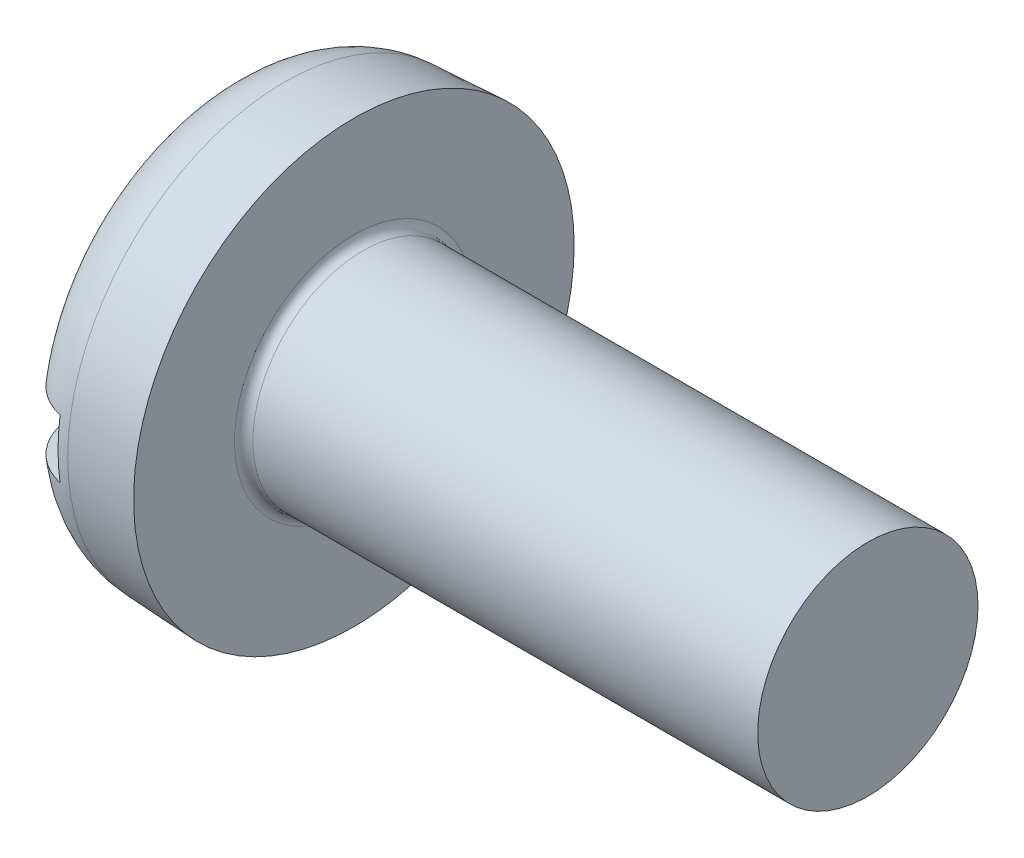
ISO-10303-21;
HEADER;
FILE_DESCRIPTION(('STEP AP214'),'2;1');
FILE_NAME('part.step','',(''),(''),'','','');
FILE_SCHEMA(('AUTOMOTIVE_DESIGN { 1 0 10303 214 1 1 1 1 }'));
ENDSEC;
DATA;
#1=APPLICATION_CONTEXT('core data for automotive mechanical design processes');
#2=APPLICATION_PROTOCOL_DEFINITION('international standard','automotive_design',2000,#1);
#3=PRODUCT_CONTEXT('',#1,'mechanical');
#4=PRODUCT('Part','Part','',(#3));
#5=PRODUCT_RELATED_PRODUCT_CATEGORY('part','',(#4));
#6=PRODUCT_DEFINITION_FORMATION('','',#4);
#7=PRODUCT_DEFINITION_CONTEXT('part definition',#1,'design');
#8=PRODUCT_DEFINITION('design','',#6,#7);
#9=PRODUCT_DEFINITION_SHAPE('','',#8);
#10=(LENGTH_UNIT() NAMED_UNIT(*) SI_UNIT(.MILLI.,.METRE.));
#11=(NAMED_UNIT(*) PLANE_ANGLE_UNIT() SI_UNIT($,.RADIAN.));
#12=(NAMED_UNIT(*) SI_UNIT($,.STERADIAN.) SOLID_ANGLE_UNIT());
#13=UNCERTAINTY_MEASURE_WITH_UNIT(LENGTH_MEASURE(1.E-05),#10,'distance_accuracy_value','');
#14=(GEOMETRIC_REPRESENTATION_CONTEXT(3) GLOBAL_UNCERTAINTY_ASSIGNED_CONTEXT((#13)) GLOBAL_UNIT_ASSIGNED_CONTEXT((#10,
#11,#12)) REPRESENTATION_CONTEXT('',''));
#15=CARTESIAN_POINT('',(0.,0.,0.));
#16=DIRECTION('',(0.,0.,1.));
#17=DIRECTION('',(1.,0.,0.));
#18=AXIS2_PLACEMENT_3D('',#15,#16,#17);
#19=CARTESIAN_POINT('',(0.,0.,0.));
#20=DIRECTION('',(1.,0.,0.));
#21=DIRECTION('',(0.,0.,-1.));
#22=AXIS2_PLACEMENT_3D('',#19,#20,#21);
#23=PLANE('',#22);
#24=CARTESIAN_POINT('',(0.,0.,0.));
#25=DIRECTION('',(1.,0.,0.));
#26=DIRECTION('',(0.,0.,-1.));
#27=AXIS2_PLACEMENT_3D('',#24,#25,#26);
#28=CIRCLE('',#27,4.10319577449427);
#29=CARTESIAN_POINT('',(0.,0.8,4.02445220667703));
#30=VERTEX_POINT('',#29);
#31=CARTESIAN_POINT('',(0.,0.8,-4.02445220667703));
#32=VERTEX_POINT('',#31);
#33=EDGE_CURVE('E98',#30,#32,#28,.F.);
#34=ORIENTED_EDGE('',*,*,#33,.T.);
#35=DIRECTION('',(0.,0.,1.));
#36=VECTOR('',#35,1.);
#37=CARTESIAN_POINT('',(0.,0.8,-6.));
#38=LINE('',#37,#36);
#39=EDGE_CURVE('E92',#32,#30,#38,.T.);
#40=ORIENTED_EDGE('',*,*,#39,.T.);
#41=EDGE_LOOP('',(#34,#40));
#42=FACE_BOUND('',#41,.T.);
#43=ADVANCED_FACE('F37',(#42),#23,.F.);
#44=CARTESIAN_POINT('',(3.6,0.,0.));
#45=DIRECTION('',(1.,0.,0.));
#46=DIRECTION('',(0.,0.,-1.));
#47=AXIS2_PLACEMENT_3D('',#44,#45,#46);
#48=PLANE('',#47);
#49=CARTESIAN_POINT('',(3.6,0.,0.));
#50=DIRECTION('',(1.,0.,0.));
#51=DIRECTION('',(0.,0.,-1.));
#52=AXIS2_PLACEMENT_3D('',#49,#50,#51);
#53=CIRCLE('',#52,3.25);
#54=CARTESIAN_POINT('',(3.6,0.,-3.25));
#55=VERTEX_POINT('',#54);
#56=EDGE_CURVE('E11',#55,#55,#53,.F.);
#57=ORIENTED_EDGE('',*,*,#56,.T.);
#58=EDGE_LOOP('',(#57));
#59=FACE_BOUND('',#58,.T.);
#60=CARTESIAN_POINT('',(3.6,0.,0.));
#61=DIRECTION('',(1.,0.,0.));
#62=DIRECTION('',(0.,0.,-1.));
#63=AXIS2_PLACEMENT_3D('',#60,#61,#62);
#64=CIRCLE('',#63,6.);
#65=CARTESIAN_POINT('',(3.6,0.,-6.));
#66=VERTEX_POINT('',#65);
#67=EDGE_CURVE('E169',#66,#66,#64,.T.);
#68=ORIENTED_EDGE('',*,*,#67,.T.);
#69=EDGE_LOOP('',(#68));
#70=FACE_BOUND('',#69,.T.);
#71=ADVANCED_FACE('F145',(#59,#70),#48,.T.);
#72=CARTESIAN_POINT('',(3.6,0.,0.));
#73=DIRECTION('',(1.,0.,0.));
#74=DIRECTION('',(0.,0.,-1.));
#75=AXIS2_PLACEMENT_3D('',#72,#73,#74);
#76=CONICAL_SURFACE('',#75,6.,0.05235987755983);
#77=CARTESIAN_POINT('',(1.7057952787627,0.,0.));
#78=DIRECTION('',(1.,0.,0.));
#79=DIRECTION('',(0.,0.,-1.));
#80=AXIS2_PLACEMENT_3D('',#77,#78,#79);
#81=CIRCLE('',#80,5.9007289370525);
#82=CARTESIAN_POINT('',(1.7057952787627,0.,-5.9007289370525));
#83=VERTEX_POINT('',#82);
#84=EDGE_CURVE('E102',#83,#83,#81,.T.);
#85=ORIENTED_EDGE('',*,*,#84,.T.);
#86=EDGE_LOOP('',(#85));
#87=FACE_BOUND('',#86,.T.);
#88=ORIENTED_EDGE('',*,*,#67,.F.);
#89=EDGE_LOOP('',(#88));
#90=FACE_BOUND('',#89,.T.);
#91=ADVANCED_FACE('F151',(#87,#90),#76,.T.);
#92=CARTESIAN_POINT('',(0.,-0.8,-4.02445220667703));
#93=VERTEX_POINT('',#92);
#94=CARTESIAN_POINT('',(0.,-0.8,4.02445220667703));
#95=VERTEX_POINT('',#94);
#96=EDGE_CURVE('E91',#93,#95,#28,.F.);
#97=ORIENTED_EDGE('',*,*,#96,.T.);
#98=DIRECTION('',(0.,0.,1.));
#99=VECTOR('',#98,1.);
#100=CARTESIAN_POINT('',(0.,-0.8,-6.));
#101=LINE('',#100,#99);
#102=EDGE_CURVE('E52',#93,#95,#101,.T.);
#103=ORIENTED_EDGE('',*,*,#102,.F.);
#104=EDGE_LOOP('',(#97,#103));
#105=FACE_BOUND('',#104,.T.);
#106=ADVANCED_FACE('F90',(#105),#23,.F.);
#107=CARTESIAN_POINT('',(17.6,0.,0.));
#108=DIRECTION('',(-1.,0.,0.));
#109=DIRECTION('',(0.,0.,1.));
#110=AXIS2_PLACEMENT_3D('',#107,#108,#109);
#111=CYLINDRICAL_SURFACE('',#110,3.);
#112=CARTESIAN_POINT('',(3.85,0.,0.));
#113=DIRECTION('',(1.,0.,0.));
#114=DIRECTION('',(0.,0.,-1.));
#115=AXIS2_PLACEMENT_3D('',#112,#113,#114);
#116=CIRCLE('',#115,3.);
#117=CARTESIAN_POINT('',(3.85,0.,-3.));
#118=VERTEX_POINT('',#117);
#119=EDGE_CURVE('E45',#118,#118,#116,.T.);
#120=ORIENTED_EDGE('',*,*,#119,.T.);
#121=EDGE_LOOP('',(#120));
#122=FACE_BOUND('',#121,.T.);
#123=CARTESIAN_POINT('',(17.6,0.,0.));
#124=DIRECTION('',(1.,0.,0.));
#125=DIRECTION('',(0.,0.,-1.));
#126=AXIS2_PLACEMENT_3D('',#123,#124,#125);
#127=CIRCLE('',#126,3.);
#128=CARTESIAN_POINT('',(17.6,0.,-3.));
#129=VERTEX_POINT('',#128);
#130=EDGE_CURVE('E172',#129,#129,#127,.T.);
#131=ORIENTED_EDGE('',*,*,#130,.F.);
#132=EDGE_LOOP('',(#131));
#133=FACE_BOUND('',#132,.T.);
#134=ADVANCED_FACE('F136',(#122,#133),#111,.T.);
#135=CARTESIAN_POINT('',(17.6,0.,0.));
#136=DIRECTION('',(1.,0.,0.));
#137=DIRECTION('',(0.,0.,-1.));
#138=AXIS2_PLACEMENT_3D('',#135,#136,#137);
#139=PLANE('',#138);
#140=ORIENTED_EDGE('',*,*,#130,.T.);
#141=EDGE_LOOP('',(#140));
#142=FACE_BOUND('',#141,.T.);
#143=ADVANCED_FACE('F160',(#142),#139,.T.);
#144=CARTESIAN_POINT('',(1.8,0.,0.));
#145=DIRECTION('',(1.,0.,0.));
#146=DIRECTION('',(0.,0.,-1.));
#147=AXIS2_PLACEMENT_3D('',#144,#145,#146);
#148=TOROIDAL_SURFACE('',#147,4.10319577449427,1.8);
#149=CARTESIAN_POINT('',(0.795380942245471,0.8,-5.53929117116706));
#150=CARTESIAN_POINT('',(0.87845574498338,0.8,-5.59574434337942));
#151=CARTESIAN_POINT('',(0.966336210479055,0.8,-5.64525097297292));
#152=CARTESIAN_POINT('',(1.14922841399968,0.8,-5.72885855618248));
#153=CARTESIAN_POINT('',(1.24424808301972,0.8,-5.7629420720306));
#154=CARTESIAN_POINT('',(1.43864757843631,0.8,-5.8146377351259));
#155=CARTESIAN_POINT('',(1.53802610495047,0.8,-5.83225475845284));
#156=CARTESIAN_POINT('',(1.73830541375391,0.8,-5.85050290561934));
#157=CARTESIAN_POINT('',(1.83920582985561,0.8,-5.85113805229902));
#158=CARTESIAN_POINT('',(2.03944020137891,0.8,-5.83543455692828));
#159=CARTESIAN_POINT('',(2.13877725239425,0.8,-5.81913536007624));
#160=CARTESIAN_POINT('',(2.33331076508571,0.8,-5.77010312512842));
#161=CARTESIAN_POINT('',(2.42850710136473,0.8,-5.73736958971231));
#162=CARTESIAN_POINT('',(2.61215063628383,0.8,-5.65639562990058));
#163=CARTESIAN_POINT('',(2.70059218831693,0.8,-5.60814240377884));
#164=CARTESIAN_POINT('',(2.86817319759165,0.8,-5.4975461641312));
#165=CARTESIAN_POINT('',(2.94731251858337,0.8,-5.43520294426807));
#166=CARTESIAN_POINT('',(3.09450885411583,0.8,-5.29786675496427));
#167=CARTESIAN_POINT('',(3.16250529588964,0.8,-5.22280888189764));
#168=CARTESIAN_POINT('',(3.28507572276598,0.8,-5.06243919779289));
#169=CARTESIAN_POINT('',(3.3396492198343,0.8,-4.97712701409425));
#170=CARTESIAN_POINT('',(3.43442580257423,0.8,-4.79778459536612));
#171=CARTESIAN_POINT('',(3.47448176404771,0.8,-4.70367663683366));
#172=CARTESIAN_POINT('',(3.53847364282646,0.8,-4.51013501119844));
#173=CARTESIAN_POINT('',(3.56240852652397,0.8,-4.41070100305555));
#174=CARTESIAN_POINT('',(3.59386800771213,0.8,-4.20780500071425));
#175=CARTESIAN_POINT('',(3.60115130935066,0.8,-4.10430562047827));
#176=CARTESIAN_POINT('',(3.59855267619067,0.8,-3.89752514549819));
#177=CARTESIAN_POINT('',(3.58866919134609,0.8,-3.79424407130875));
#178=CARTESIAN_POINT('',(3.55182490324632,0.8,-3.58892206354402));
#179=CARTESIAN_POINT('',(3.52457062660638,0.8,-3.48693378162086));
#180=CARTESIAN_POINT('',(3.4535716457687,0.8,-3.28886382965184));
#181=CARTESIAN_POINT('',(3.40982507878937,0.8,-3.19278282825154));
#182=CARTESIAN_POINT('',(3.30633797904341,0.8,-3.00785961942717));
#183=CARTESIAN_POINT('',(3.24638028523444,0.8,-2.91913881236392));
#184=CARTESIAN_POINT('',(3.11236439115431,0.8,-2.75304751493198));
#185=CARTESIAN_POINT('',(3.03830476982892,0.8,-2.67567816984487));
#186=CARTESIAN_POINT('',(2.87836542943049,0.8,-2.53505172640654));
#187=CARTESIAN_POINT('',(2.79253825604235,0.8,-2.47173499837149));
#188=CARTESIAN_POINT('',(2.61111293611645,0.8,-2.36110642982182));
#189=CARTESIAN_POINT('',(2.5155176568606,0.8,-2.31378991015811));
#190=CARTESIAN_POINT('',(2.32132958134443,0.8,-2.23876285673911));
#191=CARTESIAN_POINT('',(2.22301323096397,0.8,-2.21033847192046));
#192=CARTESIAN_POINT('',(2.0228995122902,0.8,-2.17149407469835));
#193=CARTESIAN_POINT('',(1.92110380333669,0.8,-2.16106559875461));
#194=CARTESIAN_POINT('',(1.72293070494087,0.8,-2.15880536976269));
#195=CARTESIAN_POINT('',(1.62656324284656,0.8,-2.1659823343342));
#196=CARTESIAN_POINT('',(1.43643823498141,0.8,-2.19653097895122));
#197=CARTESIAN_POINT('',(1.34268074175468,0.8,-2.21990298479173));
#198=CARTESIAN_POINT('',(1.160861657652,0.8,-2.2816336767663));
#199=CARTESIAN_POINT('',(1.07277070237791,0.8,-2.3199063642333));
#200=CARTESIAN_POINT('',(0.903827849574714,0.8,-2.41000867328327));
#201=CARTESIAN_POINT('',(0.822977480718347,0.8,-2.46184114866874));
#202=CARTESIAN_POINT('',(0.6665246225788,0.8,-2.58030411896593));
#203=CARTESIAN_POINT('',(0.591381601344176,0.8,-2.64754127473616));
#204=CARTESIAN_POINT('',(0.452799851540901,0.8,-2.79315515641091));
#205=CARTESIAN_POINT('',(0.389363822195806,0.8,-2.87153444394579));
#206=CARTESIAN_POINT('',(0.272968397125237,0.8,-3.0413069026894));
#207=CARTESIAN_POINT('',(0.220653139640506,0.8,-3.13314252313347));
#208=CARTESIAN_POINT('',(0.131919694770335,0.8,-3.32420265247772));
#209=CARTESIAN_POINT('',(0.0955031446796995,0.8,-3.42342792115407));
#210=CARTESIAN_POINT('',(0.0392342949438136,0.8,-3.62803607957258));
#211=CARTESIAN_POINT('',(0.0196305449904283,0.8,-3.73348752497937));
#212=CARTESIAN_POINT('',(-0.00140270793308036,0.8,-3.94618843745084));
#213=CARTESIAN_POINT('',(-0.002833516130886,0.8,-4.05343777483224));
#214=CARTESIAN_POINT('',(0.0126029845676314,0.8,-4.265524970474));
#215=CARTESIAN_POINT('',(0.0292852854124725,0.8,-4.37037624873173));
#216=CARTESIAN_POINT('',(0.0803433664489051,0.8,-4.57571288729644));
#217=CARTESIAN_POINT('',(0.114722065919574,0.8,-4.67619752429547));
#218=CARTESIAN_POINT('',(0.199555945895271,0.8,-4.86807702824302));
#219=CARTESIAN_POINT('',(0.249727294493198,0.8,-4.95959757725169));
#220=CARTESIAN_POINT('',(0.364927491141806,0.8,-5.13264409556055));
#221=CARTESIAN_POINT('',(0.42993665431782,0.8,-5.21418308884322));
#222=CARTESIAN_POINT('',(0.545756690375761,0.8,-5.33623348184931));
#223=CARTESIAN_POINT('',(0.592600476497963,0.8,-5.38057591721288));
#224=CARTESIAN_POINT('',(0.690763844934562,0.8,-5.46399566069975));
#225=CARTESIAN_POINT('',(0.742083386884527,0.8,-5.50307301629787));
#226=CARTESIAN_POINT('',(0.795380942245471,0.8,-5.53929117116706));
#227=B_SPLINE_CURVE_WITH_KNOTS('',3,(#149,#150,#151,#152,#153,#154,#155,#156,#157,#158,#159,
#160,#161,#162,#163,#164,#165,#166,#167,#168,#169,#170,#171,#172,#173,#174,#175,#176,#177,#178,
#179,#180,#181,#182,#183,#184,#185,#186,#187,#188,#189,#190,#191,#192,#193,#194,#195,#196,#197,
#198,#199,#200,#201,#202,#203,#204,#205,#206,#207,#208,#209,#210,#211,#212,#213,#214,#215,#216,
#217,#218,#219,#220,#221,#222,#223,#224,#225,#226),.UNSPECIFIED.,.T.,.F.,(4,2,2,2,2,2,2,2,2,2,2,
2,2,2,2,2,2,2,2,2,2,2,2,2,2,2,2,2,2,2,2,2,2,2,2,2,2,2,4),(0.,0.301088943064528,
0.602517459623087,0.903856688462172,1.20512453235887,1.5056922023808,1.80626896844385,
2.10709430986529,2.40792405693036,2.7103384467548,3.01276383019968,3.31817360120422,
3.62360295178492,3.93343092429258,4.24328687364931,4.55852173192031,4.87379220620913,
5.193515329054,5.51327068753284,5.83164211793297,6.14992036215061,6.45536038075418,
6.76065671063569,7.04916158909585,7.33767227156549,7.62454193805372,7.91147202797259,
8.21263965340722,8.51387663106301,8.82948384190645,9.14512354722957,9.46535277224277,
9.78555899743467,10.1025251275021,10.4195435625212,10.7311617234888,11.0423688487363,
11.2355375207163,11.4287044507922),.UNSPECIFIED.);
#228=CARTESIAN_POINT('',(1.4,0.8,-5.80330718488188));
#229=VERTEX_POINT('',#228);
#230=EDGE_CURVE('E129',#32,#229,#227,.T.);
#231=ORIENTED_EDGE('',*,*,#230,.F.);
#232=ORIENTED_EDGE('',*,*,#33,.F.);
#233=CARTESIAN_POINT('',(0.757928525664654,0.8,2.511162874093));
#234=CARTESIAN_POINT('',(0.837161847723164,0.8,2.45212368205305));
#235=CARTESIAN_POINT('',(0.921203150017225,0.8,2.39945229339156));
#236=CARTESIAN_POINT('',(1.09688781625821,0.8,2.30868012135704));
#237=CARTESIAN_POINT('',(1.18853561482832,0.8,2.27058791136186));
#238=CARTESIAN_POINT('',(1.3771877447462,0.8,2.21049751224704));
#239=CARTESIAN_POINT('',(1.47420184366346,0.8,2.1885297832331));
#240=CARTESIAN_POINT('',(1.67055457183337,0.8,2.16186448078466));
#241=CARTESIAN_POINT('',(1.76989229053149,0.8,2.15716025274834));
#242=CARTESIAN_POINT('',(1.96451344358203,0.8,2.16510289332269));
#243=CARTESIAN_POINT('',(2.05982105078085,0.8,2.17717270858214));
#244=CARTESIAN_POINT('',(2.24707135974226,0.8,2.21707679051499));
#245=CARTESIAN_POINT('',(2.33901366009541,0.8,2.24491293129374));
#246=CARTESIAN_POINT('',(2.51756034153515,0.8,2.31536075295066));
#247=CARTESIAN_POINT('',(2.60413557310859,0.8,2.35804598930734));
#248=CARTESIAN_POINT('',(2.76939594459319,0.8,2.45662825618261));
#249=CARTESIAN_POINT('',(2.84807936894355,0.8,2.51252815054243));
#250=CARTESIAN_POINT('',(2.99975305306252,0.8,2.63913125679642));
#251=CARTESIAN_POINT('',(3.07221854099524,0.8,2.7104632926135));
#252=CARTESIAN_POINT('',(3.20476947108547,0.8,2.86382901105123));
#253=CARTESIAN_POINT('',(3.26485222206379,0.8,2.94586501368533));
#254=CARTESIAN_POINT('',(3.3735062186452,0.8,3.12222577476204));
#255=CARTESIAN_POINT('',(3.42146302470613,0.8,3.21692986067856));
#256=CARTESIAN_POINT('',(3.50097994448395,0.8,3.41299375873038));
#257=CARTESIAN_POINT('',(3.5325387751424,0.8,3.51435409098449));
#258=CARTESIAN_POINT('',(3.57851053298407,0.8,3.72194214359383));
#259=CARTESIAN_POINT('',(3.59275307815034,0.8,3.82820771948346));
#260=CARTESIAN_POINT('',(3.6029633278805,0.8,4.04161782469627));
#261=CARTESIAN_POINT('',(3.59893188156746,0.8,4.1487623129488));
#262=CARTESIAN_POINT('',(3.5727063977291,0.8,4.35949485647519));
#263=CARTESIAN_POINT('',(3.55073232487666,0.8,4.46311023678034));
#264=CARTESIAN_POINT('',(3.48938437922724,0.8,4.66505844892768));
#265=CARTESIAN_POINT('',(3.45001208399421,0.8,4.76339175880912));
#266=CARTESIAN_POINT('',(3.35574249636989,0.8,4.9501363042901));
#267=CARTESIAN_POINT('',(3.30113116461521,0.8,5.03869190903064));
#268=CARTESIAN_POINT('',(3.17760070013266,0.8,5.20518973547548));
#269=CARTESIAN_POINT('',(3.1086827830808,0.8,5.28313285802487));
#270=CARTESIAN_POINT('',(2.95963674492637,0.8,5.42495540091088));
#271=CARTESIAN_POINT('',(2.87969438404697,0.8,5.48903009115081));
#272=CARTESIAN_POINT('',(2.71009224734586,0.8,5.60267897343961));
#273=CARTESIAN_POINT('',(2.62043307192522,0.8,5.65225406071826));
#274=CARTESIAN_POINT('',(2.43496143214145,0.8,5.73497335140955));
#275=CARTESIAN_POINT('',(2.3392233651374,0.8,5.76828442746523));
#276=CARTESIAN_POINT('',(2.14349661409105,0.8,5.81825687918681));
#277=CARTESIAN_POINT('',(2.0435080892676,0.8,5.83491887794222));
#278=CARTESIAN_POINT('',(1.84273089598241,0.8,5.85105063753386));
#279=CARTESIAN_POINT('',(1.74195006369187,0.8,5.85061808682949));
#280=CARTESIAN_POINT('',(1.54189674032909,0.8,5.83281632793422));
#281=CARTESIAN_POINT('',(1.44262422738226,0.8,5.81544736560423));
#282=CARTESIAN_POINT('',(1.24852547691985,0.8,5.76431701907752));
#283=CARTESIAN_POINT('',(1.15369399671319,0.8,5.73057552656828));
#284=CARTESIAN_POINT('',(0.971017235696906,0.8,5.64769911428333));
#285=CARTESIAN_POINT('',(0.88317199342221,0.8,5.59856410960698));
#286=CARTESIAN_POINT('',(0.716645814999135,0.8,5.48615260454249));
#287=CARTESIAN_POINT('',(0.637994882023367,0.8,5.4228316703946));
#288=CARTESIAN_POINT('',(0.492341624618725,0.8,5.28397553013161));
#289=CARTESIAN_POINT('',(0.425339633365986,0.8,5.20843997478037));
#290=CARTESIAN_POINT('',(0.304312060388457,0.8,5.04669604119634));
#291=CARTESIAN_POINT('',(0.250390184760595,0.8,4.96041008620712));
#292=CARTESIAN_POINT('',(0.157598038139586,0.8,4.78009648857864));
#293=CARTESIAN_POINT('',(0.11872858609093,0.8,4.68606842505843));
#294=CARTESIAN_POINT('',(0.056606894432513,0.8,4.4917079647061));
#295=CARTESIAN_POINT('',(0.0335535264996795,0.8,4.3913120337878));
#296=CARTESIAN_POINT('',(0.00433720155404449,0.8,4.18809937212932));
#297=CARTESIAN_POINT('',(-0.00182509596285271,0.8,4.08528254702568));
#298=CARTESIAN_POINT('',(0.00279577812161741,0.8,3.87835856250603));
#299=CARTESIAN_POINT('',(0.013856218895235,0.8,3.77425761851846));
#300=CARTESIAN_POINT('',(0.0529991825999595,0.8,3.56928023959906));
#301=CARTESIAN_POINT('',(0.0810873080126505,0.8,3.46840487745939));
#302=CARTESIAN_POINT('',(0.154049652871551,0.8,3.27093400871586));
#303=CARTESIAN_POINT('',(0.199206191894919,0.8,3.17444289514222));
#304=CARTESIAN_POINT('',(0.304940386821301,0.8,2.99039746762425));
#305=CARTESIAN_POINT('',(0.365503563167225,0.8,2.90283487007858));
#306=CARTESIAN_POINT('',(0.480650827380599,0.8,2.76309225372957));
#307=CARTESIAN_POINT('',(0.531807306616242,0.8,2.70805163459363));
#308=CARTESIAN_POINT('',(0.640361165551782,0.8,2.60450425690527));
#309=CARTESIAN_POINT('',(0.697758480489968,0.8,2.55599743056279));
#310=CARTESIAN_POINT('',(0.757928525664654,0.8,2.511162874093));
#311=B_SPLINE_CURVE_WITH_KNOTS('',3,(#233,#234,#235,#236,#237,#238,#239,#240,#241,#242,#243,
#244,#245,#246,#247,#248,#249,#250,#251,#252,#253,#254,#255,#256,#257,#258,#259,#260,#261,#262,
#263,#264,#265,#266,#267,#268,#269,#270,#271,#272,#273,#274,#275,#276,#277,#278,#279,#280,#281,
#282,#283,#284,#285,#286,#287,#288,#289,#290,#291,#292,#293,#294,#295,#296,#297,#298,#299,#300,
#301,#302,#303,#304,#305,#306,#307,#308,#309,#310),.UNSPECIFIED.,.T.,.F.,(4,2,2,2,2,2,2,2,2,2,2,
2,2,2,2,2,2,2,2,2,2,2,2,2,2,2,2,2,2,2,2,2,2,2,2,2,2,2,4),(0.,0.296178926618939,
0.592531756490968,0.889442983786813,1.18623974799346,1.47307516265602,1.75994467991487,
2.04825593951937,2.33662973845197,2.64032866740728,2.94409353076498,3.26107211981645,
3.57807550710175,3.89817341464378,4.21825644860242,4.53447336548011,4.8506616156318,
5.16127514235785,5.47186228606161,5.77774152584716,6.0836018761472,6.38625438891452,
6.68889557452742,6.98980753920229,7.29071513569134,7.59125805857297,7.89180263908393,
8.19330209674841,8.4948101763038,8.79863589015841,9.1024781316804,9.41007411957125,
9.71768211708609,10.030293733277,10.3430082614102,10.6611392102793,10.978972268961,
11.2038938530479,11.4288131033261),.UNSPECIFIED.);
#312=CARTESIAN_POINT('',(1.4,0.8,5.80330718488188));
#313=VERTEX_POINT('',#312);
#314=EDGE_CURVE('E86',#313,#30,#311,.T.);
#315=ORIENTED_EDGE('',*,*,#314,.F.);
#316=CARTESIAN_POINT('',(1.4,0.,0.));
#317=DIRECTION('',(1.,0.,0.));
#318=DIRECTION('',(0.,0.,-1.));
#319=AXIS2_PLACEMENT_3D('',#316,#317,#318);
#320=CIRCLE('',#319,5.85818865197269);
#321=CARTESIAN_POINT('',(1.4,-0.8,5.80330718488187));
#322=VERTEX_POINT('',#321);
#323=EDGE_CURVE('E60',#322,#313,#320,.F.);
#324=ORIENTED_EDGE('',*,*,#323,.F.);
#325=CARTESIAN_POINT('',(0.757928525664654,-0.8,2.511162874093));
#326=CARTESIAN_POINT('',(0.67315863186059,-0.8,2.57433609160325));
#327=CARTESIAN_POINT('',(0.593771723825369,-0.8,2.64489414232741));
#328=CARTESIAN_POINT('',(0.447908559083404,-0.8,2.7984329886876));
#329=CARTESIAN_POINT('',(0.381455457710573,-0.8,2.8814356020686));
#330=CARTESIAN_POINT('',(0.263374052587619,-0.8,3.05723601034766));
#331=CARTESIAN_POINT('',(0.21172579003154,-0.8,3.15002038502243));
#332=CARTESIAN_POINT('',(0.124575683006167,-0.8,3.34283691117289));
#333=CARTESIAN_POINT('',(0.0890673152376202,-0.8,3.44286611550326));
#334=CARTESIAN_POINT('',(0.0349476559035793,-0.8,3.64849951822531));
#335=CARTESIAN_POINT('',(0.0165124903051862,-0.8,3.75415019086231));
#336=CARTESIAN_POINT('',(-0.00215968635557222,-0.8,3.967061586618));
#337=CARTESIAN_POINT('',(-0.00239587267933894,-0.8,4.07432238248369));
#338=CARTESIAN_POINT('',(0.0154104568138618,-0.8,4.28618304056126));
#339=CARTESIAN_POINT('',(0.0332604921013899,-0.8,4.39079902993427));
#340=CARTESIAN_POINT('',(0.0865906094784175,-0.8,4.59543898879114));
#341=CARTESIAN_POINT('',(0.122068978418962,-0.8,4.69546340345977));
#342=CARTESIAN_POINT('',(0.20897202507674,-0.8,4.88620731244998));
#343=CARTESIAN_POINT('',(0.26010588583062,-0.8,4.97705931107708));
#344=CARTESIAN_POINT('',(0.37713105734262,-0.8,5.14870382898104));
#345=CARTESIAN_POINT('',(0.443021060196177,-0.8,5.22949723880989));
#346=CARTESIAN_POINT('',(0.586562304746786,-0.8,5.37740500629516));
#347=CARTESIAN_POINT('',(0.664013639980819,-0.8,5.44471341508951));
#348=CARTESIAN_POINT('',(0.829224488880378,-0.8,5.56519681722845));
#349=CARTESIAN_POINT('',(0.916983349727243,-0.8,5.61837270494939));
#350=CARTESIAN_POINT('',(1.09926556714696,-0.8,5.7084853922457));
#351=CARTESIAN_POINT('',(1.19370341534284,-0.8,5.74559521892462));
#352=CARTESIAN_POINT('',(1.38749211943933,-0.8,5.80332054885498));
#353=CARTESIAN_POINT('',(1.48684277540306,-0.8,5.82393672276409));
#354=CARTESIAN_POINT('',(1.68696986519782,-0.8,5.84798419366823));
#355=CARTESIAN_POINT('',(1.7877334940678,-0.8,5.85152217307255));
#356=CARTESIAN_POINT('',(1.98841903553126,-0.8,5.84159868585993));
#357=CARTESIAN_POINT('',(2.08834096252903,-0.8,5.82813751075169));
#358=CARTESIAN_POINT('',(2.28432996878035,-0.8,5.78465183110909));
#359=CARTESIAN_POINT('',(2.38040340220289,-0.8,5.75465594730184));
#360=CARTESIAN_POINT('',(2.56616940233601,-0.8,5.67900183333477));
#361=CARTESIAN_POINT('',(2.65586194506558,-0.8,5.63334354431538));
#362=CARTESIAN_POINT('',(2.82659169687093,-0.8,5.52755533048921));
#363=CARTESIAN_POINT('',(2.90760521328695,-0.8,5.46738717990607));
#364=CARTESIAN_POINT('',(3.05846891073144,-0.8,5.33439237132387));
#365=CARTESIAN_POINT('',(3.12831881092364,-0.8,5.26156539497063));
#366=CARTESIAN_POINT('',(3.25542965419158,-0.8,5.10478206238976));
#367=CARTESIAN_POINT('',(3.31259696933829,-0.8,5.0207498200547));
#368=CARTESIAN_POINT('',(3.412199759945,-0.8,4.84437070853248));
#369=CARTESIAN_POINT('',(3.45463453237408,-0.8,4.75202344282054));
#370=CARTESIAN_POINT('',(3.52412826651838,-0.8,4.56048137687737));
#371=CARTESIAN_POINT('',(3.55099987033837,-0.8,4.46121862997895));
#372=CARTESIAN_POINT('',(3.58798131937371,-0.8,4.25962205061403));
#373=CARTESIAN_POINT('',(3.59808989968097,-0.8,4.15728798698456));
#374=CARTESIAN_POINT('',(3.60144374891752,-0.8,3.95070853624602));
#375=CARTESIAN_POINT('',(3.59441682104932,-0.8,3.84645874931479));
#376=CARTESIAN_POINT('',(3.56326976838093,-0.8,3.64054575086673));
#377=CARTESIAN_POINT('',(3.53914796398611,-0.8,3.53888279452629));
#378=CARTESIAN_POINT('',(3.47401797519448,-0.8,3.33917758330616));
#379=CARTESIAN_POINT('',(3.43272655107501,-0.8,3.24122764951196));
#380=CARTESIAN_POINT('',(3.33443380257421,-0.8,3.05354287570545));
#381=CARTESIAN_POINT('',(3.27743049532169,-0.8,2.96380907449101));
#382=CARTESIAN_POINT('',(3.14866435618207,-0.8,2.79435748974286));
#383=CARTESIAN_POINT('',(3.07677473254457,-0.8,2.71473591198237));
#384=CARTESIAN_POINT('',(2.92042984183652,-0.8,2.56893327291016));
#385=CARTESIAN_POINT('',(2.83597458287032,-0.8,2.5027522029299));
#386=CARTESIAN_POINT('',(2.65837279810523,-0.8,2.38725243299312));
#387=CARTESIAN_POINT('',(2.56541072432,-0.8,2.33765085659211));
#388=CARTESIAN_POINT('',(2.3721579127488,-0.8,2.25576537302172));
#389=CARTESIAN_POINT('',(2.27187104781949,-0.8,2.22347238847888));
#390=CARTESIAN_POINT('',(2.07250848618643,-0.8,2.17898166357453));
#391=CARTESIAN_POINT('',(1.97365004554323,-0.8,2.16581004277985));
#392=CARTESIAN_POINT('',(1.77513986971502,-0.8,2.15705844824909));
#393=CARTESIAN_POINT('',(1.67548813763036,-0.8,2.16147840579455));
#394=CARTESIAN_POINT('',(1.48257122269315,-0.8,2.18713341190962));
#395=CARTESIAN_POINT('',(1.38921165324468,-0.8,2.20767211922126));
#396=CARTESIAN_POINT('',(1.20722136857691,-0.8,2.26378923350829));
#397=CARTESIAN_POINT('',(1.11858557944097,-0.8,2.29935112150699));
#398=CARTESIAN_POINT('',(0.985073498713587,-0.8,2.36575362228245));
#399=CARTESIAN_POINT('',(0.937844866673802,-0.8,2.39198904860899));
#400=CARTESIAN_POINT('',(0.845919081949265,-0.8,2.44856203884905));
#401=CARTESIAN_POINT('',(0.801221782218237,-0.8,2.47889936413382));
#402=CARTESIAN_POINT('',(0.757928525664654,-0.8,2.511162874093));
#403=B_SPLINE_CURVE_WITH_KNOTS('',3,(#325,#326,#327,#328,#329,#330,#331,#332,#333,#334,#335,
#336,#337,#338,#339,#340,#341,#342,#343,#344,#345,#346,#347,#348,#349,#350,#351,#352,#353,#354,
#355,#356,#357,#358,#359,#360,#361,#362,#363,#364,#365,#366,#367,#368,#369,#370,#371,#372,#373,
#374,#375,#376,#377,#378,#379,#380,#381,#382,#383,#384,#385,#386,#387,#388,#389,#390,#391,#392,
#393,#394,#395,#396,#397,#398,#399,#400,#401,#402),.UNSPECIFIED.,.T.,.F.,(4,2,2,2,2,2,2,2,2,2,2,
2,2,2,2,2,2,2,2,2,2,2,2,2,2,2,2,2,2,2,2,2,2,2,2,2,2,2,4),(0.,0.316957657788576,0.63447764655766,
0.951567542856746,1.26852916597874,1.58872526359141,1.90893587179402,2.22577410182861,
2.54258154705036,2.85382843526753,3.165047747156,3.47140311606221,3.77773909265495,
4.08068846869023,4.38362552570479,4.68466775415598,4.9857048202776,5.28622243564007,
5.58674118036466,5.88806045149224,6.18938730153184,6.49286965828741,6.79636649510697,
7.10344486722013,7.41054640986942,7.7225579323456,8.03460011462453,8.35200806559649,
8.66945609244439,8.98972818759776,9.31000007618896,9.62448945009774,9.93881373040838,
10.2364874301774,10.5341599671366,10.8196367233682,11.1048003927918,11.266684837494,
11.4285598685868),.UNSPECIFIED.);
#404=EDGE_CURVE('E97',#95,#322,#403,.T.);
#405=ORIENTED_EDGE('',*,*,#404,.F.);
#406=ORIENTED_EDGE('',*,*,#96,.F.);
#407=CARTESIAN_POINT('',(0.795380942245471,-0.8,-5.53929117116706));
#408=CARTESIAN_POINT('',(0.711294439522805,-0.8,-5.48213929425151));
#409=CARTESIAN_POINT('',(0.632007303695206,-0.8,-5.41778403044673));
#410=CARTESIAN_POINT('',(0.48534114927193,-0.8,-5.27657920679471));
#411=CARTESIAN_POINT('',(0.417978010372408,-0.8,-5.19971324338837));
#412=CARTESIAN_POINT('',(0.297141876683529,-0.8,-5.03585676991074));
#413=CARTESIAN_POINT('',(0.243655303535023,-0.8,-4.94887627865616));
#414=CARTESIAN_POINT('',(0.151908873109625,-0.8,-4.76726383827997));
#415=CARTESIAN_POINT('',(0.113645198625327,-0.8,-4.67263381448153));
#416=CARTESIAN_POINT('',(0.052968627108799,-0.8,-4.477446492115));
#417=CARTESIAN_POINT('',(0.0307083805861026,-0.8,-4.37684177055169));
#418=CARTESIAN_POINT('',(0.00309820495339441,-0.8,-4.17333718498541));
#419=CARTESIAN_POINT('',(-0.00224970825473742,-0.8,-4.07043704884759));
#420=CARTESIAN_POINT('',(0.00401592797302812,-0.8,-3.86346237456796));
#421=CARTESIAN_POINT('',(0.0159097353901166,-0.8,-3.75939633608279));
#422=CARTESIAN_POINT('',(0.0566991475700461,-0.8,-3.55465158119169));
#423=CARTESIAN_POINT('',(0.0855964592185199,-0.8,-3.45397320592691));
#424=CARTESIAN_POINT('',(0.16013727446646,-0.8,-3.25707469120138));
#425=CARTESIAN_POINT('',(0.206054259262458,-0.8,-3.16095801529376));
#426=CARTESIAN_POINT('',(0.313267323799471,-0.8,-2.9777070269795));
#427=CARTESIAN_POINT('',(0.374565316672965,-0.8,-2.89057383386699));
#428=CARTESIAN_POINT('',(0.511357959085677,-0.8,-2.72729629493929));
#429=CARTESIAN_POINT('',(0.586940913964971,-0.8,-2.65122580837116));
#430=CARTESIAN_POINT('',(0.750071752188174,-0.8,-2.51319247197666));
#431=CARTESIAN_POINT('',(0.837618906601756,-0.8,-2.45122876329399));
#432=CARTESIAN_POINT('',(1.02014765408253,-0.8,-2.3449862867808));
#433=CARTESIAN_POINT('',(1.11490804224661,-0.8,-2.30032851610761));
#434=CARTESIAN_POINT('',(1.31086650507127,-0.8,-2.22862958918725));
#435=CARTESIAN_POINT('',(1.41206126591224,-0.8,-2.20157944407645));
#436=CARTESIAN_POINT('',(1.61198764279313,-0.8,-2.16741982006281));
#437=CARTESIAN_POINT('',(1.7105450653443,-0.8,-2.15928851625597));
#438=CARTESIAN_POINT('',(1.90755592244728,-0.8,-2.16034831531846));
#439=CARTESIAN_POINT('',(2.00600937375857,-0.8,-2.16953597967799));
#440=CARTESIAN_POINT('',(2.19650491991735,-0.8,-2.20415977304978));
#441=CARTESIAN_POINT('',(2.28865112821756,-0.8,-2.22902946649041));
#442=CARTESIAN_POINT('',(2.46766144490952,-0.8,-2.29342887113006));
#443=CARTESIAN_POINT('',(2.55452467698042,-0.8,-2.33296100680364));
#444=CARTESIAN_POINT('',(2.72343627274532,-0.8,-2.42666188601569));
#445=CARTESIAN_POINT('',(2.80525681181377,-0.8,-2.48124047269259));
#446=CARTESIAN_POINT('',(2.95920876166291,-0.8,-2.60267474727829));
#447=CARTESIAN_POINT('',(3.03133787237262,-0.8,-2.66953334072624));
#448=CARTESIAN_POINT('',(3.16799536559575,-0.8,-2.8176646742912));
#449=CARTESIAN_POINT('',(3.23188139647631,-0.8,-2.89953071145793));
#450=CARTESIAN_POINT('',(3.34548840799889,-0.8,-3.07256756512575));
#451=CARTESIAN_POINT('',(3.39520697004996,-0.8,-3.16373996675333));
#452=CARTESIAN_POINT('',(3.48042918966535,-0.8,-3.35579812795566));
#453=CARTESIAN_POINT('',(3.51546292094765,-0.8,-3.45689291981918));
#454=CARTESIAN_POINT('',(3.56803986717645,-0.8,-3.66353810131585));
#455=CARTESIAN_POINT('',(3.58558276451993,-0.8,-3.76908857182006));
#456=CARTESIAN_POINT('',(3.60252456679583,-0.8,-3.98149759095537));
#457=CARTESIAN_POINT('',(3.60194854407392,-0.8,-4.08835412750104));
#458=CARTESIAN_POINT('',(3.58256237099495,-0.8,-4.30040410498767));
#459=CARTESIAN_POINT('',(3.56375356820326,-0.8,-4.40559766825326));
#460=CARTESIAN_POINT('',(3.50873843129067,-0.8,-4.60954393242868));
#461=CARTESIAN_POINT('',(3.47281285218952,-0.8,-4.70837234214603));
#462=CARTESIAN_POINT('',(3.38459388058101,-0.8,-4.89843480189266));
#463=CARTESIAN_POINT('',(3.33230196683907,-0.8,-4.98966953709913));
#464=CARTESIAN_POINT('',(3.21381755442254,-0.8,-5.1602956681592));
#465=CARTESIAN_POINT('',(3.14787898530916,-0.8,-5.2398634287563));
#466=CARTESIAN_POINT('',(3.00341565661799,-0.8,-5.38661064573132));
#467=CARTESIAN_POINT('',(2.9248918328177,-0.8,-5.45379102237599));
#468=CARTESIAN_POINT('',(2.75862691536771,-0.8,-5.57292860266168));
#469=CARTESIAN_POINT('',(2.67102260866591,-0.8,-5.62507675590403));
#470=CARTESIAN_POINT('',(2.48824917931355,-0.8,-5.7137764425648));
#471=CARTESIAN_POINT('',(2.39308075700674,-0.8,-5.75032941791334));
#472=CARTESIAN_POINT('',(2.19876397265648,-0.8,-5.80650197746463));
#473=CARTESIAN_POINT('',(2.09965702196299,-0.8,-5.82626490668814));
#474=CARTESIAN_POINT('',(1.89950220979619,-0.8,-5.84880396954073));
#475=CARTESIAN_POINT('',(1.7984539060194,-0.8,-5.8515761849674));
#476=CARTESIAN_POINT('',(1.59768626971777,-0.8,-5.84006660853948));
#477=CARTESIAN_POINT('',(1.49796361157227,-0.8,-5.82584211496299));
#478=CARTESIAN_POINT('',(1.30241147151444,-0.8,-5.78085853781765));
#479=CARTESIAN_POINT('',(1.20657726120404,-0.8,-5.75012022541433));
#480=CARTESIAN_POINT('',(1.05819874683162,-0.8,-5.68837243190039));
#481=CARTESIAN_POINT('',(1.00354785635078,-0.8,-5.66229653769971));
#482=CARTESIAN_POINT('',(0.897158429482792,-0.8,-5.60476112197506));
#483=CARTESIAN_POINT('',(0.845419884133408,-0.8,-5.57330161701943));
#484=CARTESIAN_POINT('',(0.795380942245471,-0.8,-5.53929117116706));
#485=B_SPLINE_CURVE_WITH_KNOTS('',3,(#407,#408,#409,#410,#411,#412,#413,#414,#415,#416,#417,
#418,#419,#420,#421,#422,#423,#424,#425,#426,#427,#428,#429,#430,#431,#432,#433,#434,#435,#436,
#437,#438,#439,#440,#441,#442,#443,#444,#445,#446,#447,#448,#449,#450,#451,#452,#453,#454,#455,
#456,#457,#458,#459,#460,#461,#462,#463,#464,#465,#466,#467,#468,#469,#470,#471,#472,#473,#474,
#475,#476,#477,#478,#479,#480,#481,#482,#483,#484),.UNSPECIFIED.,.T.,.F.,(4,2,2,2,2,2,2,2,2,2,2,
2,2,2,2,2,2,2,2,2,2,2,2,2,2,2,2,2,2,2,2,2,2,2,2,2,2,2,4),(0.,0.304787312577982,
0.609977518677497,0.914867957063873,1.21968189459966,1.52736609060791,1.83508696031241,
2.14786615303788,2.46067674925559,2.77874853524534,3.09685990351506,3.41700617660286,
3.73713295316066,4.04978815685689,4.36228362159624,4.65746438054216,4.95258654044079,
5.23761566549922,5.52269194192275,5.81646774069035,6.11031313870715,6.42043560257218,
6.73061097713366,7.05006874697064,7.3695323174977,7.68855384466765,8.00755179509348,
8.32148868272549,8.63539721305767,8.94391912592999,9.25241810926719,9.5568056759098,
9.86116509277636,10.1628991535169,10.4647027940683,10.7654918763676,11.0659035073748,
11.247279602993,11.428655140427),.UNSPECIFIED.);
#486=CARTESIAN_POINT('',(1.4,-0.8,-5.80330718488188));
#487=VERTEX_POINT('',#486);
#488=EDGE_CURVE('E79',#487,#93,#485,.T.);
#489=ORIENTED_EDGE('',*,*,#488,.F.);
#490=EDGE_CURVE('E85',#229,#487,#320,.F.);
#491=ORIENTED_EDGE('',*,*,#490,.F.);
#492=EDGE_LOOP('',(#231,#232,#315,#324,#405,#406,#489,#491));
#493=FACE_BOUND('',#492,.T.);
#494=ORIENTED_EDGE('',*,*,#84,.F.);
#495=EDGE_LOOP('',(#494));
#496=FACE_BOUND('',#495,.T.);
#497=ADVANCED_FACE('F95',(#493,#496),#148,.T.);
#498=CARTESIAN_POINT('',(1.4,0.8,-6.));
#499=DIRECTION('',(0.,1.,0.));
#500=DIRECTION('',(0.,0.,1.));
#501=AXIS2_PLACEMENT_3D('',#498,#499,#500);
#502=PLANE('',#501);
#503=ORIENTED_EDGE('',*,*,#230,.T.);
#504=DIRECTION('',(0.,0.,1.));
#505=VECTOR('',#504,1.);
#506=CARTESIAN_POINT('',(1.4,0.8,-6.));
#507=LINE('',#506,#505);
#508=EDGE_CURVE('E176',#229,#313,#507,.T.);
#509=ORIENTED_EDGE('',*,*,#508,.T.);
#510=ORIENTED_EDGE('',*,*,#314,.T.);
#511=ORIENTED_EDGE('',*,*,#39,.F.);
#512=EDGE_LOOP('',(#503,#509,#510,#511));
#513=FACE_BOUND('',#512,.T.);
#514=ADVANCED_FACE('F118',(#513),#502,.F.);
#515=CARTESIAN_POINT('',(1.4,0.8,-6.));
#516=DIRECTION('',(1.,0.,0.));
#517=DIRECTION('',(0.,0.,-1.));
#518=AXIS2_PLACEMENT_3D('',#515,#516,#517);
#519=PLANE('',#518);
#520=ORIENTED_EDGE('',*,*,#323,.T.);
#521=ORIENTED_EDGE('',*,*,#508,.F.);
#522=ORIENTED_EDGE('',*,*,#490,.T.);
#523=DIRECTION('',(0.,0.,1.));
#524=VECTOR('',#523,1.);
#525=CARTESIAN_POINT('',(1.4,-0.8,-6.));
#526=LINE('',#525,#524);
#527=EDGE_CURVE('E81',#487,#322,#526,.T.);
#528=ORIENTED_EDGE('',*,*,#527,.T.);
#529=EDGE_LOOP('',(#520,#521,#522,#528));
#530=FACE_BOUND('',#529,.T.);
#531=ADVANCED_FACE('F117',(#530),#519,.F.);
#532=CARTESIAN_POINT('',(1.4,-0.8,-6.));
#533=DIRECTION('',(0.,-1.,0.));
#534=DIRECTION('',(1.,0.,0.));
#535=AXIS2_PLACEMENT_3D('',#532,#533,#534);
#536=PLANE('',#535);
#537=ORIENTED_EDGE('',*,*,#488,.T.);
#538=ORIENTED_EDGE('',*,*,#102,.T.);
#539=ORIENTED_EDGE('',*,*,#404,.T.);
#540=ORIENTED_EDGE('',*,*,#527,.F.);
#541=EDGE_LOOP('',(#537,#538,#539,#540));
#542=FACE_BOUND('',#541,.T.);
#543=ADVANCED_FACE('F80',(#542),#536,.F.);
#544=CARTESIAN_POINT('',(3.85,0.,0.));
#545=DIRECTION('',(1.,0.,0.));
#546=DIRECTION('',(0.,0.,-1.));
#547=AXIS2_PLACEMENT_3D('',#544,#545,#546);
#548=TOROIDAL_SURFACE('',#547,3.25,0.25);
#549=ORIENTED_EDGE('',*,*,#56,.F.);
#550=EDGE_LOOP('',(#549));
#551=FACE_BOUND('',#550,.T.);
#552=ORIENTED_EDGE('',*,*,#119,.F.);
#553=EDGE_LOOP('',(#552));
#554=FACE_BOUND('',#553,.T.);
#555=ADVANCED_FACE('F39',(#551,#554),#548,.F.);
#556=CLOSED_SHELL('',(#43,#71,#91,#106,#134,#143,#497,#514,#531,#543,#555));
#557=MANIFOLD_SOLID_BREP('B2',#556);
#558=ADVANCED_BREP_SHAPE_REPRESENTATION('',(#18,#557),#14);
#559=SHAPE_DEFINITION_REPRESENTATION(#9,#558);
ENDSEC;
END-ISO-10303-21;
